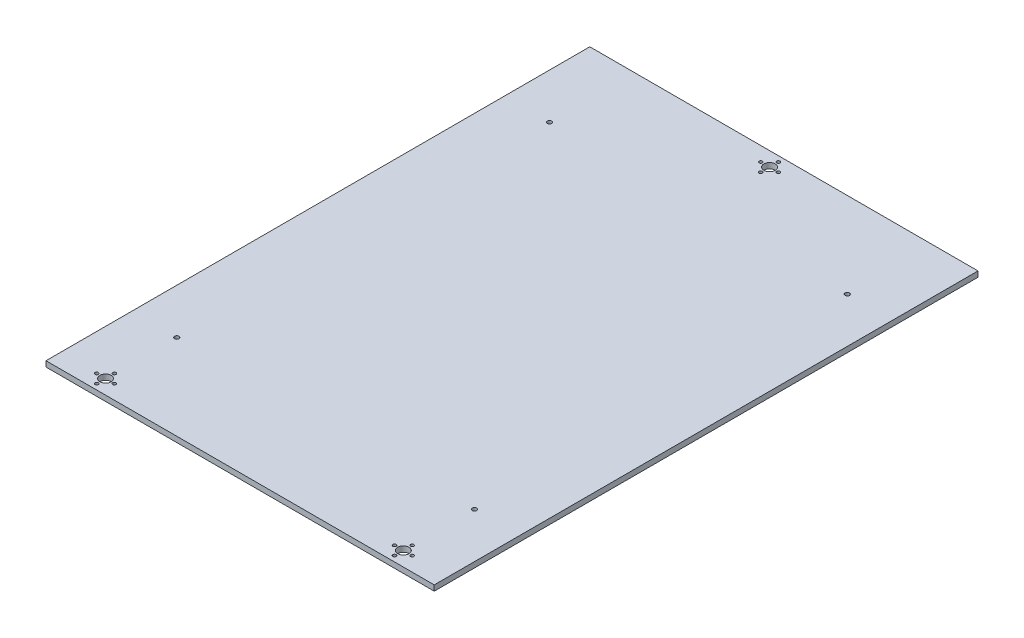
ISO-10303-21;
HEADER;
FILE_DESCRIPTION(('STEP AP214'),'2;1');
FILE_NAME('part.step','',(''),(''),'','','');
FILE_SCHEMA(('AUTOMOTIVE_DESIGN { 1 0 10303 214 1 1 1 1 }'));
ENDSEC;
DATA;
#1=APPLICATION_CONTEXT('core data for automotive mechanical design processes');
#2=APPLICATION_PROTOCOL_DEFINITION('international standard','automotive_design',2000,#1);
#3=PRODUCT_CONTEXT('',#1,'mechanical');
#4=PRODUCT('Part','Part','',(#3));
#5=PRODUCT_RELATED_PRODUCT_CATEGORY('part','',(#4));
#6=PRODUCT_DEFINITION_FORMATION('','',#4);
#7=PRODUCT_DEFINITION_CONTEXT('part definition',#1,'design');
#8=PRODUCT_DEFINITION('design','',#6,#7);
#9=PRODUCT_DEFINITION_SHAPE('','',#8);
#10=(LENGTH_UNIT() NAMED_UNIT(*) SI_UNIT(.MILLI.,.METRE.));
#11=(NAMED_UNIT(*) PLANE_ANGLE_UNIT() SI_UNIT($,.RADIAN.));
#12=(NAMED_UNIT(*) SI_UNIT($,.STERADIAN.) SOLID_ANGLE_UNIT());
#13=UNCERTAINTY_MEASURE_WITH_UNIT(LENGTH_MEASURE(1.E-05),#10,'distance_accuracy_value','');
#14=(GEOMETRIC_REPRESENTATION_CONTEXT(3) GLOBAL_UNCERTAINTY_ASSIGNED_CONTEXT((#13)) GLOBAL_UNIT_ASSIGNED_CONTEXT((#10,
#11,#12)) REPRESENTATION_CONTEXT('',''));
#15=CARTESIAN_POINT('',(0.,0.,0.));
#16=DIRECTION('',(0.,0.,1.));
#17=DIRECTION('',(1.,0.,0.));
#18=AXIS2_PLACEMENT_3D('',#15,#16,#17);
#19=CARTESIAN_POINT('',(352.,5.,0.));
#20=DIRECTION('',(0.,0.,1.));
#21=DIRECTION('',(1.,0.,0.));
#22=AXIS2_PLACEMENT_3D('',#19,#20,#21);
#23=PLANE('',#22);
#24=DIRECTION('',(0.,1.,0.));
#25=VECTOR('',#24,1.);
#26=CARTESIAN_POINT('',(0.,5.,0.));
#27=LINE('',#26,#25);
#28=CARTESIAN_POINT('',(0.,0.,0.));
#29=VERTEX_POINT('',#28);
#30=CARTESIAN_POINT('',(0.,5.,0.));
#31=VERTEX_POINT('',#30);
#32=EDGE_CURVE('E109',#29,#31,#27,.T.);
#33=ORIENTED_EDGE('',*,*,#32,.T.);
#34=DIRECTION('',(-1.,0.,0.));
#35=VECTOR('',#34,1.);
#36=CARTESIAN_POINT('',(352.,5.,0.));
#37=LINE('',#36,#35);
#38=CARTESIAN_POINT('',(352.,5.,0.));
#39=VERTEX_POINT('',#38);
#40=EDGE_CURVE('E11',#39,#31,#37,.T.);
#41=ORIENTED_EDGE('',*,*,#40,.F.);
#42=DIRECTION('',(0.,1.,0.));
#43=VECTOR('',#42,1.);
#44=CARTESIAN_POINT('',(352.,5.,0.));
#45=LINE('',#44,#43);
#46=CARTESIAN_POINT('',(352.,0.,0.));
#47=VERTEX_POINT('',#46);
#48=EDGE_CURVE('E97',#47,#39,#45,.T.);
#49=ORIENTED_EDGE('',*,*,#48,.F.);
#50=DIRECTION('',(-1.,0.,0.));
#51=VECTOR('',#50,1.);
#52=CARTESIAN_POINT('',(352.,0.,0.));
#53=LINE('',#52,#51);
#54=EDGE_CURVE('E105',#47,#29,#53,.T.);
#55=ORIENTED_EDGE('',*,*,#54,.T.);
#56=EDGE_LOOP('',(#33,#41,#49,#55));
#57=FACE_BOUND('',#56,.T.);
#58=ADVANCED_FACE('F46',(#57),#23,.F.);
#59=CARTESIAN_POINT('',(352.,4.99999999999985,493.05));
#60=DIRECTION('',(0.,-1.,0.));
#61=DIRECTION('',(0.,0.,-1.));
#62=AXIS2_PLACEMENT_3D('',#59,#60,#61);
#63=PLANE('',#62);
#64=CARTESIAN_POINT('',(41.,4.99999999999987,415.525));
#65=DIRECTION('',(0.,1.,0.));
#66=DIRECTION('',(0.,0.,1.));
#67=AXIS2_PLACEMENT_3D('',#64,#65,#66);
#68=CIRCLE('',#67,2.);
#69=CARTESIAN_POINT('',(41.,4.99999999999987,417.525));
#70=VERTEX_POINT('',#69);
#71=EDGE_CURVE('E222',#70,#70,#68,.T.);
#72=ORIENTED_EDGE('',*,*,#71,.F.);
#73=EDGE_LOOP('',(#72));
#74=FACE_BOUND('',#73,.T.);
#75=CARTESIAN_POINT('',(311.,4.99999999999987,415.525));
#76=DIRECTION('',(0.,1.,0.));
#77=DIRECTION('',(0.,0.,1.));
#78=AXIS2_PLACEMENT_3D('',#75,#76,#77);
#79=CIRCLE('',#78,2.);
#80=CARTESIAN_POINT('',(311.,4.99999999999987,417.525));
#81=VERTEX_POINT('',#80);
#82=EDGE_CURVE('E228',#81,#81,#79,.T.);
#83=ORIENTED_EDGE('',*,*,#82,.F.);
#84=EDGE_LOOP('',(#83));
#85=FACE_BOUND('',#84,.T.);
#86=CARTESIAN_POINT('',(311.,4.99999999999998,77.525));
#87=DIRECTION('',(0.,1.,0.));
#88=DIRECTION('',(0.,0.,1.));
#89=AXIS2_PLACEMENT_3D('',#86,#87,#88);
#90=CIRCLE('',#89,2.);
#91=CARTESIAN_POINT('',(311.,4.99999999999998,79.525));
#92=VERTEX_POINT('',#91);
#93=EDGE_CURVE('E216',#92,#92,#90,.T.);
#94=ORIENTED_EDGE('',*,*,#93,.F.);
#95=EDGE_LOOP('',(#94));
#96=FACE_BOUND('',#95,.T.);
#97=CARTESIAN_POINT('',(41.,4.99999999999998,77.525));
#98=DIRECTION('',(0.,1.,0.));
#99=DIRECTION('',(0.,0.,1.));
#100=AXIS2_PLACEMENT_3D('',#97,#98,#99);
#101=CIRCLE('',#100,2.);
#102=CARTESIAN_POINT('',(41.,4.99999999999998,79.525));
#103=VERTEX_POINT('',#102);
#104=EDGE_CURVE('E213',#103,#103,#101,.T.);
#105=ORIENTED_EDGE('',*,*,#104,.F.);
#106=EDGE_LOOP('',(#105));
#107=FACE_BOUND('',#106,.T.);
#108=CARTESIAN_POINT('',(184.,5.,13.));
#109=DIRECTION('',(0.,1.,0.));
#110=DIRECTION('',(0.,0.,1.));
#111=AXIS2_PLACEMENT_3D('',#108,#109,#110);
#112=CIRCLE('',#111,1.50000000000003);
#113=CARTESIAN_POINT('',(184.,5.,14.5));
#114=VERTEX_POINT('',#113);
#115=EDGE_CURVE('E169',#114,#114,#112,.T.);
#116=ORIENTED_EDGE('',*,*,#115,.F.);
#117=EDGE_LOOP('',(#116));
#118=FACE_BOUND('',#117,.T.);
#119=CARTESIAN_POINT('',(176.,5.,21.));
#120=DIRECTION('',(0.,1.,0.));
#121=DIRECTION('',(0.,0.,1.));
#122=AXIS2_PLACEMENT_3D('',#119,#120,#121);
#123=CIRCLE('',#122,1.50000000000003);
#124=CARTESIAN_POINT('',(176.,5.,22.5));
#125=VERTEX_POINT('',#124);
#126=EDGE_CURVE('E159',#125,#125,#123,.T.);
#127=ORIENTED_EDGE('',*,*,#126,.F.);
#128=EDGE_LOOP('',(#127));
#129=FACE_BOUND('',#128,.T.);
#130=CARTESIAN_POINT('',(176.,5.,5.));
#131=DIRECTION('',(0.,1.,0.));
#132=DIRECTION('',(0.,0.,1.));
#133=AXIS2_PLACEMENT_3D('',#130,#131,#132);
#134=CIRCLE('',#133,1.50000000000003);
#135=CARTESIAN_POINT('',(176.,5.,6.50000000000002));
#136=VERTEX_POINT('',#135);
#137=EDGE_CURVE('E158',#136,#136,#134,.T.);
#138=ORIENTED_EDGE('',*,*,#137,.F.);
#139=EDGE_LOOP('',(#138));
#140=FACE_BOUND('',#139,.T.);
#141=CARTESIAN_POINT('',(168.,5.,13.));
#142=DIRECTION('',(0.,1.,0.));
#143=DIRECTION('',(0.,0.,1.));
#144=AXIS2_PLACEMENT_3D('',#141,#142,#143);
#145=CIRCLE('',#144,1.50000000000003);
#146=CARTESIAN_POINT('',(168.,5.,14.5));
#147=VERTEX_POINT('',#146);
#148=EDGE_CURVE('E126',#147,#147,#145,.T.);
#149=ORIENTED_EDGE('',*,*,#148,.F.);
#150=EDGE_LOOP('',(#149));
#151=FACE_BOUND('',#150,.T.);
#152=CARTESIAN_POINT('',(41.,5.00000000000003,472.05));
#153=DIRECTION('',(0.,1.,0.));
#154=DIRECTION('',(0.,0.,1.));
#155=AXIS2_PLACEMENT_3D('',#152,#153,#154);
#156=CIRCLE('',#155,1.5);
#157=CARTESIAN_POINT('',(41.,5.00000000000003,473.55));
#158=VERTEX_POINT('',#157);
#159=EDGE_CURVE('E146',#158,#158,#156,.T.);
#160=ORIENTED_EDGE('',*,*,#159,.F.);
#161=EDGE_LOOP('',(#160));
#162=FACE_BOUND('',#161,.T.);
#163=CARTESIAN_POINT('',(33.,5.00000000000003,480.05));
#164=DIRECTION('',(0.,1.,0.));
#165=DIRECTION('',(0.,0.,1.));
#166=AXIS2_PLACEMENT_3D('',#163,#164,#165);
#167=CIRCLE('',#166,1.5);
#168=CARTESIAN_POINT('',(33.,5.00000000000003,481.55));
#169=VERTEX_POINT('',#168);
#170=EDGE_CURVE('E133',#169,#169,#167,.T.);
#171=ORIENTED_EDGE('',*,*,#170,.F.);
#172=EDGE_LOOP('',(#171));
#173=FACE_BOUND('',#172,.T.);
#174=CARTESIAN_POINT('',(49.,5.00000000000003,480.05));
#175=DIRECTION('',(0.,1.,0.));
#176=DIRECTION('',(0.,0.,1.));
#177=AXIS2_PLACEMENT_3D('',#174,#175,#176);
#178=CIRCLE('',#177,1.5);
#179=CARTESIAN_POINT('',(49.,5.00000000000003,481.55));
#180=VERTEX_POINT('',#179);
#181=EDGE_CURVE('E132',#180,#180,#178,.T.);
#182=ORIENTED_EDGE('',*,*,#181,.F.);
#183=EDGE_LOOP('',(#182));
#184=FACE_BOUND('',#183,.T.);
#185=CARTESIAN_POINT('',(41.,5.00000000000003,488.05));
#186=DIRECTION('',(0.,1.,0.));
#187=DIRECTION('',(0.,0.,1.));
#188=AXIS2_PLACEMENT_3D('',#185,#186,#187);
#189=CIRCLE('',#188,1.5);
#190=CARTESIAN_POINT('',(41.,5.00000000000003,489.55));
#191=VERTEX_POINT('',#190);
#192=EDGE_CURVE('E139',#191,#191,#189,.T.);
#193=ORIENTED_EDGE('',*,*,#192,.F.);
#194=EDGE_LOOP('',(#193));
#195=FACE_BOUND('',#194,.T.);
#196=CARTESIAN_POINT('',(311.,5.00000000000003,480.05));
#197=DIRECTION('',(0.,1.,0.));
#198=DIRECTION('',(0.,0.,1.));
#199=AXIS2_PLACEMENT_3D('',#196,#197,#198);
#200=CIRCLE('',#199,5.09999999999998);
#201=CARTESIAN_POINT('',(311.,5.00000000000003,485.15));
#202=VERTEX_POINT('',#201);
#203=EDGE_CURVE('E204',#202,#202,#200,.T.);
#204=ORIENTED_EDGE('',*,*,#203,.F.);
#205=EDGE_LOOP('',(#204));
#206=FACE_BOUND('',#205,.T.);
#207=CARTESIAN_POINT('',(41.,5.00000000000003,480.05));
#208=DIRECTION('',(0.,1.,0.));
#209=DIRECTION('',(0.,0.,1.));
#210=AXIS2_PLACEMENT_3D('',#207,#208,#209);
#211=CIRCLE('',#210,5.09999999999998);
#212=CARTESIAN_POINT('',(41.,5.00000000000003,485.15));
#213=VERTEX_POINT('',#212);
#214=EDGE_CURVE('E193',#213,#213,#211,.T.);
#215=ORIENTED_EDGE('',*,*,#214,.F.);
#216=EDGE_LOOP('',(#215));
#217=FACE_BOUND('',#216,.T.);
#218=CARTESIAN_POINT('',(303.,5.00000000000003,480.05));
#219=DIRECTION('',(0.,1.,0.));
#220=DIRECTION('',(0.,0.,1.));
#221=AXIS2_PLACEMENT_3D('',#218,#219,#220);
#222=CIRCLE('',#221,1.50000000000002);
#223=CARTESIAN_POINT('',(303.,5.00000000000003,481.55));
#224=VERTEX_POINT('',#223);
#225=EDGE_CURVE('E147',#224,#224,#222,.T.);
#226=ORIENTED_EDGE('',*,*,#225,.F.);
#227=EDGE_LOOP('',(#226));
#228=FACE_BOUND('',#227,.T.);
#229=CARTESIAN_POINT('',(311.,5.00000000000003,488.05));
#230=DIRECTION('',(0.,1.,0.));
#231=DIRECTION('',(0.,0.,1.));
#232=AXIS2_PLACEMENT_3D('',#229,#230,#231);
#233=CIRCLE('',#232,1.50000000000002);
#234=CARTESIAN_POINT('',(311.,5.00000000000003,489.55));
#235=VERTEX_POINT('',#234);
#236=EDGE_CURVE('E180',#235,#235,#233,.T.);
#237=ORIENTED_EDGE('',*,*,#236,.F.);
#238=EDGE_LOOP('',(#237));
#239=FACE_BOUND('',#238,.T.);
#240=CARTESIAN_POINT('',(311.,5.00000000000003,472.05));
#241=DIRECTION('',(0.,1.,0.));
#242=DIRECTION('',(0.,0.,1.));
#243=AXIS2_PLACEMENT_3D('',#240,#241,#242);
#244=CIRCLE('',#243,1.50000000000002);
#245=CARTESIAN_POINT('',(311.,5.00000000000003,473.55));
#246=VERTEX_POINT('',#245);
#247=EDGE_CURVE('E181',#246,#246,#244,.T.);
#248=ORIENTED_EDGE('',*,*,#247,.F.);
#249=EDGE_LOOP('',(#248));
#250=FACE_BOUND('',#249,.T.);
#251=CARTESIAN_POINT('',(319.,5.00000000000003,480.05));
#252=DIRECTION('',(0.,1.,0.));
#253=DIRECTION('',(0.,0.,1.));
#254=AXIS2_PLACEMENT_3D('',#251,#252,#253);
#255=CIRCLE('',#254,1.50000000000002);
#256=CARTESIAN_POINT('',(319.,5.00000000000003,481.55));
#257=VERTEX_POINT('',#256);
#258=EDGE_CURVE('E192',#257,#257,#255,.T.);
#259=ORIENTED_EDGE('',*,*,#258,.F.);
#260=EDGE_LOOP('',(#259));
#261=FACE_BOUND('',#260,.T.);
#262=CARTESIAN_POINT('',(176.,5.,13.));
#263=DIRECTION('',(0.,1.,0.));
#264=DIRECTION('',(0.,0.,1.));
#265=AXIS2_PLACEMENT_3D('',#262,#263,#264);
#266=CIRCLE('',#265,5.09999999999998);
#267=CARTESIAN_POINT('',(176.,5.,18.1));
#268=VERTEX_POINT('',#267);
#269=EDGE_CURVE('E123',#268,#268,#266,.T.);
#270=ORIENTED_EDGE('',*,*,#269,.F.);
#271=EDGE_LOOP('',(#270));
#272=FACE_BOUND('',#271,.T.);
#273=DIRECTION('',(0.,0.,1.));
#274=VECTOR('',#273,1.);
#275=CARTESIAN_POINT('',(0.,4.99999999999985,493.05));
#276=LINE('',#275,#274);
#277=CARTESIAN_POINT('',(0.,4.99999999999985,493.05));
#278=VERTEX_POINT('',#277);
#279=EDGE_CURVE('E101',#31,#278,#276,.T.);
#280=ORIENTED_EDGE('',*,*,#279,.T.);
#281=DIRECTION('',(-1.,0.,0.));
#282=VECTOR('',#281,1.);
#283=CARTESIAN_POINT('',(352.,4.99999999999985,493.05));
#284=LINE('',#283,#282);
#285=CARTESIAN_POINT('',(352.,4.99999999999985,493.05));
#286=VERTEX_POINT('',#285);
#287=EDGE_CURVE('E54',#286,#278,#284,.T.);
#288=ORIENTED_EDGE('',*,*,#287,.F.);
#289=DIRECTION('',(0.,0.,1.));
#290=VECTOR('',#289,1.);
#291=CARTESIAN_POINT('',(352.,4.99999999999985,493.05));
#292=LINE('',#291,#290);
#293=EDGE_CURVE('E92',#39,#286,#292,.T.);
#294=ORIENTED_EDGE('',*,*,#293,.F.);
#295=ORIENTED_EDGE('',*,*,#40,.T.);
#296=EDGE_LOOP('',(#280,#288,#294,#295));
#297=FACE_BOUND('',#296,.T.);
#298=ADVANCED_FACE('F100',(#74,#85,#96,#107,#118,#129,#140,#151,#162,#173,#184,#195,#206,#217,
#228,#239,#250,#261,#272,#297),#63,.F.);
#299=CARTESIAN_POINT('',(352.,-2.11334236511861E-13,493.05));
#300=DIRECTION('',(0.,0.,-1.));
#301=DIRECTION('',(-1.,0.,0.));
#302=AXIS2_PLACEMENT_3D('',#299,#300,#301);
#303=PLANE('',#302);
#304=DIRECTION('',(0.,-1.,0.));
#305=VECTOR('',#304,1.);
#306=CARTESIAN_POINT('',(0.,-2.11334236511861E-13,493.05));
#307=LINE('',#306,#305);
#308=CARTESIAN_POINT('',(0.,-2.11334236511861E-13,493.05));
#309=VERTEX_POINT('',#308);
#310=EDGE_CURVE('E79',#278,#309,#307,.T.);
#311=ORIENTED_EDGE('',*,*,#310,.T.);
#312=DIRECTION('',(-1.,0.,0.));
#313=VECTOR('',#312,1.);
#314=CARTESIAN_POINT('',(352.,-2.11334236511861E-13,493.05));
#315=LINE('',#314,#313);
#316=CARTESIAN_POINT('',(352.,-2.11334236511861E-13,493.05));
#317=VERTEX_POINT('',#316);
#318=EDGE_CURVE('E102',#317,#309,#315,.T.);
#319=ORIENTED_EDGE('',*,*,#318,.F.);
#320=DIRECTION('',(0.,-1.,0.));
#321=VECTOR('',#320,1.);
#322=CARTESIAN_POINT('',(352.,-2.11334236511861E-13,493.05));
#323=LINE('',#322,#321);
#324=EDGE_CURVE('E95',#286,#317,#323,.T.);
#325=ORIENTED_EDGE('',*,*,#324,.F.);
#326=ORIENTED_EDGE('',*,*,#287,.T.);
#327=EDGE_LOOP('',(#311,#319,#325,#326));
#328=FACE_BOUND('',#327,.T.);
#329=ADVANCED_FACE('F103',(#328),#303,.F.);
#330=CARTESIAN_POINT('',(352.,0.,0.));
#331=DIRECTION('',(0.,1.,0.));
#332=DIRECTION('',(0.,0.,1.));
#333=AXIS2_PLACEMENT_3D('',#330,#331,#332);
#334=PLANE('',#333);
#335=CARTESIAN_POINT('',(41.,-3.6949610038306E-13,415.525));
#336=DIRECTION('',(0.,1.,0.));
#337=DIRECTION('',(0.,0.,1.));
#338=AXIS2_PLACEMENT_3D('',#335,#336,#337);
#339=CIRCLE('',#338,2.);
#340=CARTESIAN_POINT('',(41.,-3.70107958145529E-13,417.525));
#341=VERTEX_POINT('',#340);
#342=EDGE_CURVE('E219',#341,#341,#339,.T.);
#343=ORIENTED_EDGE('',*,*,#342,.T.);
#344=EDGE_LOOP('',(#343));
#345=FACE_BOUND('',#344,.T.);
#346=CARTESIAN_POINT('',(311.,-3.6949610038306E-13,415.525));
#347=DIRECTION('',(0.,1.,0.));
#348=DIRECTION('',(0.,0.,1.));
#349=AXIS2_PLACEMENT_3D('',#346,#347,#348);
#350=CIRCLE('',#349,2.);
#351=CARTESIAN_POINT('',(311.,-3.70107958145529E-13,417.525));
#352=VERTEX_POINT('',#351);
#353=EDGE_CURVE('E225',#352,#352,#350,.T.);
#354=ORIENTED_EDGE('',*,*,#353,.T.);
#355=EDGE_LOOP('',(#354));
#356=FACE_BOUND('',#355,.T.);
#357=CARTESIAN_POINT('',(311.,-2.65412691824451E-13,77.525));
#358=DIRECTION('',(0.,1.,0.));
#359=DIRECTION('',(0.,0.,1.));
#360=AXIS2_PLACEMENT_3D('',#357,#358,#359);
#361=CIRCLE('',#360,2.);
#362=CARTESIAN_POINT('',(311.,-2.6602454958692E-13,79.525));
#363=VERTEX_POINT('',#362);
#364=EDGE_CURVE('E231',#363,#363,#361,.T.);
#365=ORIENTED_EDGE('',*,*,#364,.T.);
#366=EDGE_LOOP('',(#365));
#367=FACE_BOUND('',#366,.T.);
#368=CARTESIAN_POINT('',(41.,-2.65412691824451E-13,77.525));
#369=DIRECTION('',(0.,1.,0.));
#370=DIRECTION('',(0.,0.,1.));
#371=AXIS2_PLACEMENT_3D('',#368,#369,#370);
#372=CIRCLE('',#371,2.);
#373=CARTESIAN_POINT('',(41.,-2.6602454958692E-13,79.525));
#374=VERTEX_POINT('',#373);
#375=EDGE_CURVE('E205',#374,#374,#372,.T.);
#376=ORIENTED_EDGE('',*,*,#375,.T.);
#377=EDGE_LOOP('',(#376));
#378=FACE_BOUND('',#377,.T.);
#379=CARTESIAN_POINT('',(184.,-2.41126563160776E-13,13.));
#380=DIRECTION('',(0.,1.,0.));
#381=DIRECTION('',(0.,0.,1.));
#382=AXIS2_PLACEMENT_3D('',#379,#380,#381);
#383=CIRCLE('',#382,1.50000000000003);
#384=CARTESIAN_POINT('',(184.,-2.41033431979174E-13,14.5));
#385=VERTEX_POINT('',#384);
#386=EDGE_CURVE('E142',#385,#385,#383,.T.);
#387=ORIENTED_EDGE('',*,*,#386,.T.);
#388=EDGE_LOOP('',(#387));
#389=FACE_BOUND('',#388,.T.);
#390=CARTESIAN_POINT('',(176.,-2.40259201422788E-13,21.));
#391=DIRECTION('',(0.,1.,0.));
#392=DIRECTION('',(0.,0.,1.));
#393=AXIS2_PLACEMENT_3D('',#390,#391,#392);
#394=CIRCLE('',#393,1.50000000000003);
#395=CARTESIAN_POINT('',(176.,-2.40166070241186E-13,22.5));
#396=VERTEX_POINT('',#395);
#397=EDGE_CURVE('E172',#396,#396,#394,.T.);
#398=ORIENTED_EDGE('',*,*,#397,.T.);
#399=EDGE_LOOP('',(#398));
#400=FACE_BOUND('',#399,.T.);
#401=CARTESIAN_POINT('',(176.,-2.41993924898765E-13,5.));
#402=DIRECTION('',(0.,1.,0.));
#403=DIRECTION('',(0.,0.,1.));
#404=AXIS2_PLACEMENT_3D('',#401,#402,#403);
#405=CIRCLE('',#404,1.50000000000003);
#406=CARTESIAN_POINT('',(176.,-2.41900793717162E-13,6.50000000000002));
#407=VERTEX_POINT('',#406);
#408=EDGE_CURVE('E155',#407,#407,#405,.T.);
#409=ORIENTED_EDGE('',*,*,#408,.T.);
#410=EDGE_LOOP('',(#409));
#411=FACE_BOUND('',#410,.T.);
#412=CARTESIAN_POINT('',(168.,-2.41126563160776E-13,13.));
#413=DIRECTION('',(0.,1.,0.));
#414=DIRECTION('',(0.,0.,1.));
#415=AXIS2_PLACEMENT_3D('',#412,#413,#414);
#416=CIRCLE('',#415,1.50000000000003);
#417=CARTESIAN_POINT('',(168.,-2.41033431979174E-13,14.5));
#418=VERTEX_POINT('',#417);
#419=EDGE_CURVE('E162',#418,#418,#416,.T.);
#420=ORIENTED_EDGE('',*,*,#419,.T.);
#421=EDGE_LOOP('',(#420));
#422=FACE_BOUND('',#421,.T.);
#423=CARTESIAN_POINT('',(41.,-2.12503625807159E-13,472.05));
#424=DIRECTION('',(0.,1.,0.));
#425=DIRECTION('',(0.,0.,1.));
#426=AXIS2_PLACEMENT_3D('',#423,#424,#425);
#427=CIRCLE('',#426,1.5);
#428=CARTESIAN_POINT('',(41.,-2.12410494625557E-13,473.55));
#429=VERTEX_POINT('',#428);
#430=EDGE_CURVE('E143',#429,#429,#427,.T.);
#431=ORIENTED_EDGE('',*,*,#430,.T.);
#432=EDGE_LOOP('',(#431));
#433=FACE_BOUND('',#432,.T.);
#434=CARTESIAN_POINT('',(33.,-2.12503625807159E-13,480.05));
#435=DIRECTION('',(0.,1.,0.));
#436=DIRECTION('',(0.,0.,1.));
#437=AXIS2_PLACEMENT_3D('',#434,#435,#436);
#438=CIRCLE('',#437,1.5);
#439=CARTESIAN_POINT('',(33.,-2.12410494625557E-13,481.55));
#440=VERTEX_POINT('',#439);
#441=EDGE_CURVE('E150',#440,#440,#438,.T.);
#442=ORIENTED_EDGE('',*,*,#441,.T.);
#443=EDGE_LOOP('',(#442));
#444=FACE_BOUND('',#443,.T.);
#445=CARTESIAN_POINT('',(49.,-2.12503625807159E-13,480.05));
#446=DIRECTION('',(0.,1.,0.));
#447=DIRECTION('',(0.,0.,1.));
#448=AXIS2_PLACEMENT_3D('',#445,#446,#447);
#449=CIRCLE('',#448,1.5);
#450=CARTESIAN_POINT('',(49.,-2.12410494625557E-13,481.55));
#451=VERTEX_POINT('',#450);
#452=EDGE_CURVE('E129',#451,#451,#449,.T.);
#453=ORIENTED_EDGE('',*,*,#452,.T.);
#454=EDGE_LOOP('',(#453));
#455=FACE_BOUND('',#454,.T.);
#456=CARTESIAN_POINT('',(41.,-2.1163626406917E-13,488.05));
#457=DIRECTION('',(0.,1.,0.));
#458=DIRECTION('',(0.,0.,1.));
#459=AXIS2_PLACEMENT_3D('',#456,#457,#458);
#460=CIRCLE('',#459,1.5);
#461=CARTESIAN_POINT('',(41.,-2.11543132887568E-13,489.55));
#462=VERTEX_POINT('',#461);
#463=EDGE_CURVE('E136',#462,#462,#460,.T.);
#464=ORIENTED_EDGE('',*,*,#463,.T.);
#465=EDGE_LOOP('',(#464));
#466=FACE_BOUND('',#465,.T.);
#467=CARTESIAN_POINT('',(311.,-2.12503625807159E-13,480.05));
#468=DIRECTION('',(0.,1.,0.));
#469=DIRECTION('',(0.,0.,1.));
#470=AXIS2_PLACEMENT_3D('',#467,#468,#469);
#471=CIRCLE('',#470,5.09999999999998);
#472=CARTESIAN_POINT('',(311.,-2.12186979789711E-13,485.15));
#473=VERTEX_POINT('',#472);
#474=EDGE_CURVE('E201',#473,#473,#471,.T.);
#475=ORIENTED_EDGE('',*,*,#474,.T.);
#476=EDGE_LOOP('',(#475));
#477=FACE_BOUND('',#476,.T.);
#478=CARTESIAN_POINT('',(41.,-2.12503625807159E-13,480.05));
#479=DIRECTION('',(0.,1.,0.));
#480=DIRECTION('',(0.,0.,1.));
#481=AXIS2_PLACEMENT_3D('',#478,#479,#480);
#482=CIRCLE('',#481,5.09999999999998);
#483=CARTESIAN_POINT('',(41.,-2.12186979789711E-13,485.15));
#484=VERTEX_POINT('',#483);
#485=EDGE_CURVE('E208',#484,#484,#482,.T.);
#486=ORIENTED_EDGE('',*,*,#485,.T.);
#487=EDGE_LOOP('',(#486));
#488=FACE_BOUND('',#487,.T.);
#489=CARTESIAN_POINT('',(303.,-2.12503625807159E-13,480.05));
#490=DIRECTION('',(0.,1.,0.));
#491=DIRECTION('',(0.,0.,1.));
#492=AXIS2_PLACEMENT_3D('',#489,#490,#491);
#493=CIRCLE('',#492,1.50000000000002);
#494=CARTESIAN_POINT('',(303.,-2.12410494625557E-13,481.55));
#495=VERTEX_POINT('',#494);
#496=EDGE_CURVE('E184',#495,#495,#493,.T.);
#497=ORIENTED_EDGE('',*,*,#496,.T.);
#498=EDGE_LOOP('',(#497));
#499=FACE_BOUND('',#498,.T.);
#500=CARTESIAN_POINT('',(311.,-2.1163626406917E-13,488.05));
#501=DIRECTION('',(0.,1.,0.));
#502=DIRECTION('',(0.,0.,1.));
#503=AXIS2_PLACEMENT_3D('',#500,#501,#502);
#504=CIRCLE('',#503,1.50000000000002);
#505=CARTESIAN_POINT('',(311.,-2.11543132887568E-13,489.55));
#506=VERTEX_POINT('',#505);
#507=EDGE_CURVE('E177',#506,#506,#504,.T.);
#508=ORIENTED_EDGE('',*,*,#507,.T.);
#509=EDGE_LOOP('',(#508));
#510=FACE_BOUND('',#509,.T.);
#511=CARTESIAN_POINT('',(311.,-2.12503625807159E-13,472.05));
#512=DIRECTION('',(0.,1.,0.));
#513=DIRECTION('',(0.,0.,1.));
#514=AXIS2_PLACEMENT_3D('',#511,#512,#513);
#515=CIRCLE('',#514,1.50000000000002);
#516=CARTESIAN_POINT('',(311.,-2.12410494625557E-13,473.55));
#517=VERTEX_POINT('',#516);
#518=EDGE_CURVE('E196',#517,#517,#515,.T.);
#519=ORIENTED_EDGE('',*,*,#518,.T.);
#520=EDGE_LOOP('',(#519));
#521=FACE_BOUND('',#520,.T.);
#522=CARTESIAN_POINT('',(319.,-2.12503625807159E-13,480.05));
#523=DIRECTION('',(0.,1.,0.));
#524=DIRECTION('',(0.,0.,1.));
#525=AXIS2_PLACEMENT_3D('',#522,#523,#524);
#526=CIRCLE('',#525,1.50000000000002);
#527=CARTESIAN_POINT('',(319.,-2.12410494625557E-13,481.55));
#528=VERTEX_POINT('',#527);
#529=EDGE_CURVE('E189',#528,#528,#526,.T.);
#530=ORIENTED_EDGE('',*,*,#529,.T.);
#531=EDGE_LOOP('',(#530));
#532=FACE_BOUND('',#531,.T.);
#533=CARTESIAN_POINT('',(176.,-2.41126563160776E-13,13.));
#534=DIRECTION('',(0.,1.,0.));
#535=DIRECTION('',(0.,0.,1.));
#536=AXIS2_PLACEMENT_3D('',#533,#534,#535);
#537=CIRCLE('',#536,5.09999999999998);
#538=CARTESIAN_POINT('',(176.,-2.40809917143329E-13,18.1));
#539=VERTEX_POINT('',#538);
#540=EDGE_CURVE('E112',#539,#539,#537,.T.);
#541=ORIENTED_EDGE('',*,*,#540,.T.);
#542=EDGE_LOOP('',(#541));
#543=FACE_BOUND('',#542,.T.);
#544=DIRECTION('',(0.,0.,-1.));
#545=VECTOR('',#544,1.);
#546=CARTESIAN_POINT('',(0.,0.,0.));
#547=LINE('',#546,#545);
#548=EDGE_CURVE('E85',#309,#29,#547,.T.);
#549=ORIENTED_EDGE('',*,*,#548,.T.);
#550=ORIENTED_EDGE('',*,*,#54,.F.);
#551=DIRECTION('',(0.,0.,-1.));
#552=VECTOR('',#551,1.);
#553=CARTESIAN_POINT('',(352.,0.,0.));
#554=LINE('',#553,#552);
#555=EDGE_CURVE('E62',#317,#47,#554,.T.);
#556=ORIENTED_EDGE('',*,*,#555,.F.);
#557=ORIENTED_EDGE('',*,*,#318,.T.);
#558=EDGE_LOOP('',(#549,#550,#556,#557));
#559=FACE_BOUND('',#558,.T.);
#560=ADVANCED_FACE('F117',(#345,#356,#367,#378,#389,#400,#411,#422,#433,#444,#455,#466,#477,
#488,#499,#510,#521,#532,#543,#559),#334,.F.);
#561=CARTESIAN_POINT('',(352.,0.,0.));
#562=DIRECTION('',(-1.,0.,0.));
#563=DIRECTION('',(0.,0.,1.));
#564=AXIS2_PLACEMENT_3D('',#561,#562,#563);
#565=PLANE('',#564);
#566=ORIENTED_EDGE('',*,*,#48,.T.);
#567=ORIENTED_EDGE('',*,*,#293,.T.);
#568=ORIENTED_EDGE('',*,*,#324,.T.);
#569=ORIENTED_EDGE('',*,*,#555,.T.);
#570=EDGE_LOOP('',(#566,#567,#568,#569));
#571=FACE_BOUND('',#570,.T.);
#572=ADVANCED_FACE('F93',(#571),#565,.F.);
#573=CARTESIAN_POINT('',(0.,0.,0.));
#574=DIRECTION('',(-1.,0.,0.));
#575=DIRECTION('',(0.,0.,1.));
#576=AXIS2_PLACEMENT_3D('',#573,#574,#575);
#577=PLANE('',#576);
#578=ORIENTED_EDGE('',*,*,#32,.F.);
#579=ORIENTED_EDGE('',*,*,#548,.F.);
#580=ORIENTED_EDGE('',*,*,#310,.F.);
#581=ORIENTED_EDGE('',*,*,#279,.F.);
#582=EDGE_LOOP('',(#578,#579,#580,#581));
#583=FACE_BOUND('',#582,.T.);
#584=ADVANCED_FACE('F120',(#583),#577,.T.);
#585=CARTESIAN_POINT('',(176.,-2.41126563160776E-13,13.));
#586=DIRECTION('',(0.,1.,0.));
#587=DIRECTION('',(0.,0.,1.));
#588=AXIS2_PLACEMENT_3D('',#585,#586,#587);
#589=CYLINDRICAL_SURFACE('',#588,5.09999999999998);
#590=ORIENTED_EDGE('',*,*,#540,.F.);
#591=EDGE_LOOP('',(#590));
#592=FACE_BOUND('',#591,.T.);
#593=ORIENTED_EDGE('',*,*,#269,.T.);
#594=EDGE_LOOP('',(#593));
#595=FACE_BOUND('',#594,.T.);
#596=ADVANCED_FACE('F274',(#592,#595),#589,.F.);
#597=CARTESIAN_POINT('',(319.,-2.12503625807159E-13,480.05));
#598=DIRECTION('',(0.,1.,0.));
#599=DIRECTION('',(0.,0.,1.));
#600=AXIS2_PLACEMENT_3D('',#597,#598,#599);
#601=CYLINDRICAL_SURFACE('',#600,1.50000000000002);
#602=ORIENTED_EDGE('',*,*,#529,.F.);
#603=EDGE_LOOP('',(#602));
#604=FACE_BOUND('',#603,.T.);
#605=ORIENTED_EDGE('',*,*,#258,.T.);
#606=EDGE_LOOP('',(#605));
#607=FACE_BOUND('',#606,.T.);
#608=ADVANCED_FACE('F276',(#604,#607),#601,.F.);
#609=CARTESIAN_POINT('',(311.,-2.12503625807159E-13,472.05));
#610=DIRECTION('',(0.,1.,0.));
#611=DIRECTION('',(0.,0.,1.));
#612=AXIS2_PLACEMENT_3D('',#609,#610,#611);
#613=CYLINDRICAL_SURFACE('',#612,1.50000000000002);
#614=ORIENTED_EDGE('',*,*,#518,.F.);
#615=EDGE_LOOP('',(#614));
#616=FACE_BOUND('',#615,.T.);
#617=ORIENTED_EDGE('',*,*,#247,.T.);
#618=EDGE_LOOP('',(#617));
#619=FACE_BOUND('',#618,.T.);
#620=ADVANCED_FACE('F283',(#616,#619),#613,.F.);
#621=CARTESIAN_POINT('',(311.,-2.1163626406917E-13,488.05));
#622=DIRECTION('',(0.,1.,0.));
#623=DIRECTION('',(0.,0.,1.));
#624=AXIS2_PLACEMENT_3D('',#621,#622,#623);
#625=CYLINDRICAL_SURFACE('',#624,1.50000000000002);
#626=ORIENTED_EDGE('',*,*,#507,.F.);
#627=EDGE_LOOP('',(#626));
#628=FACE_BOUND('',#627,.T.);
#629=ORIENTED_EDGE('',*,*,#236,.T.);
#630=EDGE_LOOP('',(#629));
#631=FACE_BOUND('',#630,.T.);
#632=ADVANCED_FACE('F488',(#628,#631),#625,.F.);
#633=CARTESIAN_POINT('',(303.,-2.12503625807159E-13,480.05));
#634=DIRECTION('',(0.,1.,0.));
#635=DIRECTION('',(0.,0.,1.));
#636=AXIS2_PLACEMENT_3D('',#633,#634,#635);
#637=CYLINDRICAL_SURFACE('',#636,1.50000000000002);
#638=ORIENTED_EDGE('',*,*,#496,.F.);
#639=EDGE_LOOP('',(#638));
#640=FACE_BOUND('',#639,.T.);
#641=ORIENTED_EDGE('',*,*,#225,.T.);
#642=EDGE_LOOP('',(#641));
#643=FACE_BOUND('',#642,.T.);
#644=ADVANCED_FACE('F479',(#640,#643),#637,.F.);
#645=CARTESIAN_POINT('',(41.,-2.12503625807159E-13,480.05));
#646=DIRECTION('',(0.,1.,0.));
#647=DIRECTION('',(0.,0.,1.));
#648=AXIS2_PLACEMENT_3D('',#645,#646,#647);
#649=CYLINDRICAL_SURFACE('',#648,5.09999999999998);
#650=ORIENTED_EDGE('',*,*,#485,.F.);
#651=EDGE_LOOP('',(#650));
#652=FACE_BOUND('',#651,.T.);
#653=ORIENTED_EDGE('',*,*,#214,.T.);
#654=EDGE_LOOP('',(#653));
#655=FACE_BOUND('',#654,.T.);
#656=ADVANCED_FACE('F470',(#652,#655),#649,.F.);
#657=CARTESIAN_POINT('',(311.,-2.12503625807159E-13,480.05));
#658=DIRECTION('',(0.,1.,0.));
#659=DIRECTION('',(0.,0.,1.));
#660=AXIS2_PLACEMENT_3D('',#657,#658,#659);
#661=CYLINDRICAL_SURFACE('',#660,5.09999999999998);
#662=ORIENTED_EDGE('',*,*,#474,.F.);
#663=EDGE_LOOP('',(#662));
#664=FACE_BOUND('',#663,.T.);
#665=ORIENTED_EDGE('',*,*,#203,.T.);
#666=EDGE_LOOP('',(#665));
#667=FACE_BOUND('',#666,.T.);
#668=ADVANCED_FACE('F461',(#664,#667),#661,.F.);
#669=CARTESIAN_POINT('',(41.,-2.1163626406917E-13,488.05));
#670=DIRECTION('',(0.,1.,0.));
#671=DIRECTION('',(0.,0.,1.));
#672=AXIS2_PLACEMENT_3D('',#669,#670,#671);
#673=CYLINDRICAL_SURFACE('',#672,1.5);
#674=ORIENTED_EDGE('',*,*,#463,.F.);
#675=EDGE_LOOP('',(#674));
#676=FACE_BOUND('',#675,.T.);
#677=ORIENTED_EDGE('',*,*,#192,.T.);
#678=EDGE_LOOP('',(#677));
#679=FACE_BOUND('',#678,.T.);
#680=ADVANCED_FACE('F453',(#676,#679),#673,.F.);
#681=CARTESIAN_POINT('',(49.,-2.12503625807159E-13,480.05));
#682=DIRECTION('',(0.,1.,0.));
#683=DIRECTION('',(0.,0.,1.));
#684=AXIS2_PLACEMENT_3D('',#681,#682,#683);
#685=CYLINDRICAL_SURFACE('',#684,1.5);
#686=ORIENTED_EDGE('',*,*,#452,.F.);
#687=EDGE_LOOP('',(#686));
#688=FACE_BOUND('',#687,.T.);
#689=ORIENTED_EDGE('',*,*,#181,.T.);
#690=EDGE_LOOP('',(#689));
#691=FACE_BOUND('',#690,.T.);
#692=ADVANCED_FACE('F444',(#688,#691),#685,.F.);
#693=CARTESIAN_POINT('',(33.,-2.12503625807159E-13,480.05));
#694=DIRECTION('',(0.,1.,0.));
#695=DIRECTION('',(0.,0.,1.));
#696=AXIS2_PLACEMENT_3D('',#693,#694,#695);
#697=CYLINDRICAL_SURFACE('',#696,1.5);
#698=ORIENTED_EDGE('',*,*,#441,.F.);
#699=EDGE_LOOP('',(#698));
#700=FACE_BOUND('',#699,.T.);
#701=ORIENTED_EDGE('',*,*,#170,.T.);
#702=EDGE_LOOP('',(#701));
#703=FACE_BOUND('',#702,.T.);
#704=ADVANCED_FACE('F435',(#700,#703),#697,.F.);
#705=CARTESIAN_POINT('',(41.,-2.12503625807159E-13,472.05));
#706=DIRECTION('',(0.,1.,0.));
#707=DIRECTION('',(0.,0.,1.));
#708=AXIS2_PLACEMENT_3D('',#705,#706,#707);
#709=CYLINDRICAL_SURFACE('',#708,1.5);
#710=ORIENTED_EDGE('',*,*,#430,.F.);
#711=EDGE_LOOP('',(#710));
#712=FACE_BOUND('',#711,.T.);
#713=ORIENTED_EDGE('',*,*,#159,.T.);
#714=EDGE_LOOP('',(#713));
#715=FACE_BOUND('',#714,.T.);
#716=ADVANCED_FACE('F426',(#712,#715),#709,.F.);
#717=CARTESIAN_POINT('',(168.,-2.41126563160776E-13,13.));
#718=DIRECTION('',(0.,1.,0.));
#719=DIRECTION('',(0.,0.,1.));
#720=AXIS2_PLACEMENT_3D('',#717,#718,#719);
#721=CYLINDRICAL_SURFACE('',#720,1.50000000000003);
#722=ORIENTED_EDGE('',*,*,#419,.F.);
#723=EDGE_LOOP('',(#722));
#724=FACE_BOUND('',#723,.T.);
#725=ORIENTED_EDGE('',*,*,#148,.T.);
#726=EDGE_LOOP('',(#725));
#727=FACE_BOUND('',#726,.T.);
#728=ADVANCED_FACE('F417',(#724,#727),#721,.F.);
#729=CARTESIAN_POINT('',(176.,-2.41993924898765E-13,5.));
#730=DIRECTION('',(0.,1.,0.));
#731=DIRECTION('',(0.,0.,1.));
#732=AXIS2_PLACEMENT_3D('',#729,#730,#731);
#733=CYLINDRICAL_SURFACE('',#732,1.50000000000003);
#734=ORIENTED_EDGE('',*,*,#408,.F.);
#735=EDGE_LOOP('',(#734));
#736=FACE_BOUND('',#735,.T.);
#737=ORIENTED_EDGE('',*,*,#137,.T.);
#738=EDGE_LOOP('',(#737));
#739=FACE_BOUND('',#738,.T.);
#740=ADVANCED_FACE('F408',(#736,#739),#733,.F.);
#741=CARTESIAN_POINT('',(176.,-2.40259201422788E-13,21.));
#742=DIRECTION('',(0.,1.,0.));
#743=DIRECTION('',(0.,0.,1.));
#744=AXIS2_PLACEMENT_3D('',#741,#742,#743);
#745=CYLINDRICAL_SURFACE('',#744,1.50000000000003);
#746=ORIENTED_EDGE('',*,*,#397,.F.);
#747=EDGE_LOOP('',(#746));
#748=FACE_BOUND('',#747,.T.);
#749=ORIENTED_EDGE('',*,*,#126,.T.);
#750=EDGE_LOOP('',(#749));
#751=FACE_BOUND('',#750,.T.);
#752=ADVANCED_FACE('F400',(#748,#751),#745,.F.);
#753=CARTESIAN_POINT('',(184.,-2.41126563160776E-13,13.));
#754=DIRECTION('',(0.,1.,0.));
#755=DIRECTION('',(0.,0.,1.));
#756=AXIS2_PLACEMENT_3D('',#753,#754,#755);
#757=CYLINDRICAL_SURFACE('',#756,1.50000000000003);
#758=ORIENTED_EDGE('',*,*,#386,.F.);
#759=EDGE_LOOP('',(#758));
#760=FACE_BOUND('',#759,.T.);
#761=ORIENTED_EDGE('',*,*,#115,.T.);
#762=EDGE_LOOP('',(#761));
#763=FACE_BOUND('',#762,.T.);
#764=ADVANCED_FACE('F350',(#760,#763),#757,.F.);
#765=CARTESIAN_POINT('',(41.,-2.65412691824451E-13,77.525));
#766=DIRECTION('',(0.,1.,0.));
#767=DIRECTION('',(0.,0.,1.));
#768=AXIS2_PLACEMENT_3D('',#765,#766,#767);
#769=CYLINDRICAL_SURFACE('',#768,2.);
#770=ORIENTED_EDGE('',*,*,#375,.F.);
#771=EDGE_LOOP('',(#770));
#772=FACE_BOUND('',#771,.T.);
#773=ORIENTED_EDGE('',*,*,#104,.T.);
#774=EDGE_LOOP('',(#773));
#775=FACE_BOUND('',#774,.T.);
#776=ADVANCED_FACE('F359',(#772,#775),#769,.F.);
#777=CARTESIAN_POINT('',(311.,-2.65412691824451E-13,77.525));
#778=DIRECTION('',(0.,1.,0.));
#779=DIRECTION('',(0.,0.,1.));
#780=AXIS2_PLACEMENT_3D('',#777,#778,#779);
#781=CYLINDRICAL_SURFACE('',#780,2.);
#782=ORIENTED_EDGE('',*,*,#364,.F.);
#783=EDGE_LOOP('',(#782));
#784=FACE_BOUND('',#783,.T.);
#785=ORIENTED_EDGE('',*,*,#93,.T.);
#786=EDGE_LOOP('',(#785));
#787=FACE_BOUND('',#786,.T.);
#788=ADVANCED_FACE('F237',(#784,#787),#781,.F.);
#789=CARTESIAN_POINT('',(311.,-3.6949610038306E-13,415.525));
#790=DIRECTION('',(0.,1.,0.));
#791=DIRECTION('',(0.,0.,1.));
#792=AXIS2_PLACEMENT_3D('',#789,#790,#791);
#793=CYLINDRICAL_SURFACE('',#792,2.);
#794=ORIENTED_EDGE('',*,*,#353,.F.);
#795=EDGE_LOOP('',(#794));
#796=FACE_BOUND('',#795,.T.);
#797=ORIENTED_EDGE('',*,*,#82,.T.);
#798=EDGE_LOOP('',(#797));
#799=FACE_BOUND('',#798,.T.);
#800=ADVANCED_FACE('F371',(#796,#799),#793,.F.);
#801=CARTESIAN_POINT('',(41.,-3.6949610038306E-13,415.525));
#802=DIRECTION('',(0.,1.,0.));
#803=DIRECTION('',(0.,0.,1.));
#804=AXIS2_PLACEMENT_3D('',#801,#802,#803);
#805=CYLINDRICAL_SURFACE('',#804,2.);
#806=ORIENTED_EDGE('',*,*,#342,.F.);
#807=EDGE_LOOP('',(#806));
#808=FACE_BOUND('',#807,.T.);
#809=ORIENTED_EDGE('',*,*,#71,.T.);
#810=EDGE_LOOP('',(#809));
#811=FACE_BOUND('',#810,.T.);
#812=ADVANCED_FACE('F380',(#808,#811),#805,.F.);
#813=CLOSED_SHELL('',(#58,#298,#329,#560,#572,#584,#596,#608,#620,#632,#644,#656,#668,#680,#692,
#704,#716,#728,#740,#752,#764,#776,#788,#800,#812));
#814=MANIFOLD_SOLID_BREP('B2',#813);
#815=ADVANCED_BREP_SHAPE_REPRESENTATION('',(#18,#814),#14);
#816=SHAPE_DEFINITION_REPRESENTATION(#9,#815);
ENDSEC;
END-ISO-10303-21;
